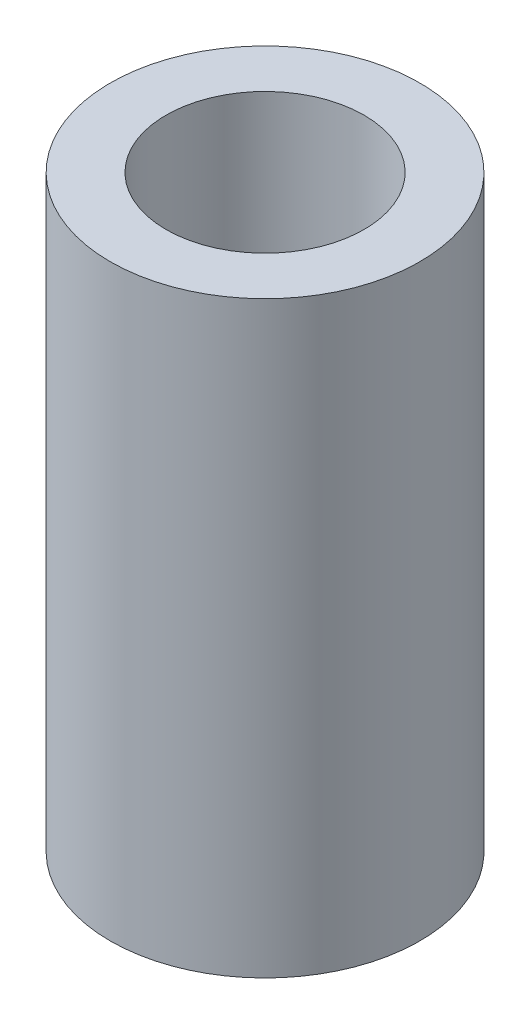
ISO-10303-21;
HEADER;
FILE_DESCRIPTION(('STEP AP214'),'2;1');
FILE_NAME('part.step','',(''),(''),'','','');
FILE_SCHEMA(('AUTOMOTIVE_DESIGN { 1 0 10303 214 1 1 1 1 }'));
ENDSEC;
DATA;
#1=APPLICATION_CONTEXT('core data for automotive mechanical design processes');
#2=APPLICATION_PROTOCOL_DEFINITION('international standard','automotive_design',2000,#1);
#3=PRODUCT_CONTEXT('',#1,'mechanical');
#4=PRODUCT('Part','Part','',(#3));
#5=PRODUCT_RELATED_PRODUCT_CATEGORY('part','',(#4));
#6=PRODUCT_DEFINITION_FORMATION('','',#4);
#7=PRODUCT_DEFINITION_CONTEXT('part definition',#1,'design');
#8=PRODUCT_DEFINITION('design','',#6,#7);
#9=PRODUCT_DEFINITION_SHAPE('','',#8);
#10=(LENGTH_UNIT() NAMED_UNIT(*) SI_UNIT(.MILLI.,.METRE.));
#11=(NAMED_UNIT(*) PLANE_ANGLE_UNIT() SI_UNIT($,.RADIAN.));
#12=(NAMED_UNIT(*) SI_UNIT($,.STERADIAN.) SOLID_ANGLE_UNIT());
#13=UNCERTAINTY_MEASURE_WITH_UNIT(LENGTH_MEASURE(1.E-05),#10,'distance_accuracy_value','');
#14=(GEOMETRIC_REPRESENTATION_CONTEXT(3) GLOBAL_UNCERTAINTY_ASSIGNED_CONTEXT((#13)) GLOBAL_UNIT_ASSIGNED_CONTEXT((#10,
#11,#12)) REPRESENTATION_CONTEXT('',''));
#15=CARTESIAN_POINT('',(0.,0.,0.));
#16=DIRECTION('',(0.,0.,1.));
#17=DIRECTION('',(1.,0.,0.));
#18=AXIS2_PLACEMENT_3D('',#15,#16,#17);
#19=CARTESIAN_POINT('',(0.,9.5,0.));
#20=DIRECTION('',(0.,1.,0.));
#21=DIRECTION('',(0.,0.,1.));
#22=AXIS2_PLACEMENT_3D('',#19,#20,#21);
#23=PLANE('',#22);
#24=CARTESIAN_POINT('',(0.,9.5,0.));
#25=DIRECTION('',(0.,1.,0.));
#26=DIRECTION('',(0.,0.,1.));
#27=AXIS2_PLACEMENT_3D('',#24,#25,#26);
#28=CIRCLE('',#27,2.5);
#29=CARTESIAN_POINT('',(0.,9.5,2.5));
#30=VERTEX_POINT('',#29);
#31=EDGE_CURVE('E10',#30,#30,#28,.T.);
#32=ORIENTED_EDGE('',*,*,#31,.T.);
#33=EDGE_LOOP('',(#32));
#34=FACE_BOUND('',#33,.T.);
#35=CARTESIAN_POINT('',(0.,9.5,0.));
#36=DIRECTION('',(0.,1.,0.));
#37=DIRECTION('',(0.,0.,1.));
#38=AXIS2_PLACEMENT_3D('',#35,#36,#37);
#39=CIRCLE('',#38,1.6);
#40=CARTESIAN_POINT('',(0.,9.5,1.6));
#41=VERTEX_POINT('',#40);
#42=EDGE_CURVE('E41',#41,#41,#39,.T.);
#43=ORIENTED_EDGE('',*,*,#42,.F.);
#44=EDGE_LOOP('',(#43));
#45=FACE_BOUND('',#44,.T.);
#46=ADVANCED_FACE('F30',(#34,#45),#23,.T.);
#47=CARTESIAN_POINT('',(0.,0.,0.));
#48=DIRECTION('',(0.,1.,0.));
#49=DIRECTION('',(0.,0.,1.));
#50=AXIS2_PLACEMENT_3D('',#47,#48,#49);
#51=PLANE('',#50);
#52=CARTESIAN_POINT('',(0.,0.,0.));
#53=DIRECTION('',(0.,1.,0.));
#54=DIRECTION('',(0.,0.,1.));
#55=AXIS2_PLACEMENT_3D('',#52,#53,#54);
#56=CIRCLE('',#55,2.5);
#57=CARTESIAN_POINT('',(0.,0.,2.5));
#58=VERTEX_POINT('',#57);
#59=EDGE_CURVE('E34',#58,#58,#56,.T.);
#60=ORIENTED_EDGE('',*,*,#59,.F.);
#61=EDGE_LOOP('',(#60));
#62=FACE_BOUND('',#61,.T.);
#63=CARTESIAN_POINT('',(0.,0.,0.));
#64=DIRECTION('',(0.,1.,0.));
#65=DIRECTION('',(0.,0.,1.));
#66=AXIS2_PLACEMENT_3D('',#63,#64,#65);
#67=CIRCLE('',#66,1.6);
#68=CARTESIAN_POINT('',(0.,0.,1.6));
#69=VERTEX_POINT('',#68);
#70=EDGE_CURVE('E43',#69,#69,#67,.T.);
#71=ORIENTED_EDGE('',*,*,#70,.T.);
#72=EDGE_LOOP('',(#71));
#73=FACE_BOUND('',#72,.T.);
#74=ADVANCED_FACE('F53',(#62,#73),#51,.F.);
#75=CARTESIAN_POINT('',(0.,9.5,0.));
#76=DIRECTION('',(0.,-1.,0.));
#77=DIRECTION('',(0.,0.,-1.));
#78=AXIS2_PLACEMENT_3D('',#75,#76,#77);
#79=CYLINDRICAL_SURFACE('',#78,2.5);
#80=ORIENTED_EDGE('',*,*,#31,.F.);
#81=EDGE_LOOP('',(#80));
#82=FACE_BOUND('',#81,.T.);
#83=ORIENTED_EDGE('',*,*,#59,.T.);
#84=EDGE_LOOP('',(#83));
#85=FACE_BOUND('',#84,.T.);
#86=ADVANCED_FACE('F32',(#82,#85),#79,.T.);
#87=CARTESIAN_POINT('',(0.,9.5,0.));
#88=DIRECTION('',(0.,-1.,0.));
#89=DIRECTION('',(0.,0.,-1.));
#90=AXIS2_PLACEMENT_3D('',#87,#88,#89);
#91=CYLINDRICAL_SURFACE('',#90,1.6);
#92=ORIENTED_EDGE('',*,*,#42,.T.);
#93=EDGE_LOOP('',(#92));
#94=FACE_BOUND('',#93,.T.);
#95=ORIENTED_EDGE('',*,*,#70,.F.);
#96=EDGE_LOOP('',(#95));
#97=FACE_BOUND('',#96,.T.);
#98=ADVANCED_FACE('F49',(#94,#97),#91,.F.);
#99=CLOSED_SHELL('',(#46,#74,#86,#98));
#100=MANIFOLD_SOLID_BREP('B2',#99);
#101=ADVANCED_BREP_SHAPE_REPRESENTATION('',(#18,#100),#14);
#102=SHAPE_DEFINITION_REPRESENTATION(#9,#101);
ENDSEC;
END-ISO-10303-21;
